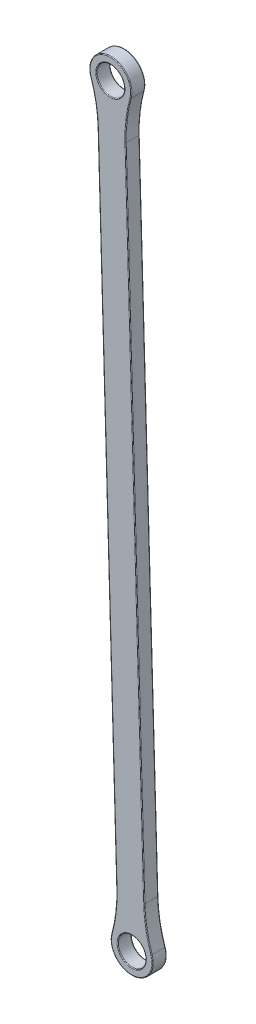
ISO-10303-21;
HEADER;
FILE_DESCRIPTION(('STEP AP214'),'2;1');
FILE_NAME('part.step','',(''),(''),'','','');
FILE_SCHEMA(('AUTOMOTIVE_DESIGN { 1 0 10303 214 1 1 1 1 }'));
ENDSEC;
DATA;
#1=APPLICATION_CONTEXT('core data for automotive mechanical design processes');
#2=APPLICATION_PROTOCOL_DEFINITION('international standard','automotive_design',2000,#1);
#3=PRODUCT_CONTEXT('',#1,'mechanical');
#4=PRODUCT('Part','Part','',(#3));
#5=PRODUCT_RELATED_PRODUCT_CATEGORY('part','',(#4));
#6=PRODUCT_DEFINITION_FORMATION('','',#4);
#7=PRODUCT_DEFINITION_CONTEXT('part definition',#1,'design');
#8=PRODUCT_DEFINITION('design','',#6,#7);
#9=PRODUCT_DEFINITION_SHAPE('','',#8);
#10=(LENGTH_UNIT() NAMED_UNIT(*) SI_UNIT(.MILLI.,.METRE.));
#11=(NAMED_UNIT(*) PLANE_ANGLE_UNIT() SI_UNIT($,.RADIAN.));
#12=(NAMED_UNIT(*) SI_UNIT($,.STERADIAN.) SOLID_ANGLE_UNIT());
#13=UNCERTAINTY_MEASURE_WITH_UNIT(LENGTH_MEASURE(1.E-05),#10,'distance_accuracy_value','');
#14=(GEOMETRIC_REPRESENTATION_CONTEXT(3) GLOBAL_UNCERTAINTY_ASSIGNED_CONTEXT((#13)) GLOBAL_UNIT_ASSIGNED_CONTEXT((#10,
#11,#12)) REPRESENTATION_CONTEXT('',''));
#15=CARTESIAN_POINT('',(0.,0.,0.));
#16=DIRECTION('',(0.,0.,1.));
#17=DIRECTION('',(1.,0.,0.));
#18=AXIS2_PLACEMENT_3D('',#15,#16,#17);
#19=CARTESIAN_POINT('',(33.742734460424,59.5858139379744,-3.));
#20=DIRECTION('',(0.,0.,1.));
#21=DIRECTION('',(1.,0.,0.));
#22=AXIS2_PLACEMENT_3D('',#19,#20,#21);
#23=CYLINDRICAL_SURFACE('',#22,4.5);
#24=DIRECTION('',(0.,0.,1.));
#25=VECTOR('',#24,1.);
#26=CARTESIAN_POINT('',(29.4024735021623,60.7741467256181,-3.));
#27=LINE('',#26,#25);
#28=CARTESIAN_POINT('',(29.4024735021623,60.7741467256181,-0.15));
#29=VERTEX_POINT('',#28);
#30=CARTESIAN_POINT('',(29.4024735021623,60.7741467256181,-2.85));
#31=VERTEX_POINT('',#30);
#32=EDGE_CURVE('E304',#29,#31,#27,.F.);
#33=ORIENTED_EDGE('',*,*,#32,.T.);
#34=CARTESIAN_POINT('',(33.742734460424,59.5858139379744,-2.85));
#35=DIRECTION('',(0.,0.,1.));
#36=DIRECTION('',(1.,0.,0.));
#37=AXIS2_PLACEMENT_3D('',#34,#35,#36);
#38=CIRCLE('',#37,4.5);
#39=CARTESIAN_POINT('',(38.0076191911635,61.0213480662711,-2.85));
#40=VERTEX_POINT('',#39);
#41=EDGE_CURVE('E227',#31,#40,#38,.T.);
#42=ORIENTED_EDGE('',*,*,#41,.T.);
#43=DIRECTION('',(0.,0.,1.));
#44=VECTOR('',#43,1.);
#45=CARTESIAN_POINT('',(38.0076191911635,61.0213480662711,-3.));
#46=LINE('',#45,#44);
#47=CARTESIAN_POINT('',(38.0076191911635,61.0213480662711,-0.15));
#48=VERTEX_POINT('',#47);
#49=EDGE_CURVE('E299',#40,#48,#46,.T.);
#50=ORIENTED_EDGE('',*,*,#49,.T.);
#51=CARTESIAN_POINT('',(33.742734460424,59.5858139379744,-0.15));
#52=DIRECTION('',(0.,0.,1.));
#53=DIRECTION('',(1.,0.,0.));
#54=AXIS2_PLACEMENT_3D('',#51,#52,#53);
#55=CIRCLE('',#54,4.5);
#56=EDGE_CURVE('E225',#48,#29,#55,.F.);
#57=ORIENTED_EDGE('',*,*,#56,.T.);
#58=EDGE_LOOP('',(#33,#42,#50,#57));
#59=FACE_BOUND('',#58,.T.);
#60=ADVANCED_FACE('F39',(#59),#23,.T.);
#61=CARTESIAN_POINT('',(32.4264677407564,0.931520114575329,-3.));
#62=DIRECTION('',(0.999587630540553,0.0287153072475694,0.));
#63=DIRECTION('',(-0.0287153072475694,0.999587630540553,0.));
#64=AXIS2_PLACEMENT_3D('',#61,#62,#63);
#65=PLANE('',#64);
#66=DIRECTION('',(0.,0.,1.));
#67=VECTOR('',#66,1.);
#68=CARTESIAN_POINT('',(26.4384646146928,209.375532391615,-3.));
#69=LINE('',#68,#67);
#70=CARTESIAN_POINT('',(26.4384646146928,209.375532391615,-0.15));
#71=VERTEX_POINT('',#70);
#72=CARTESIAN_POINT('',(26.4384646146928,209.375532391615,-2.85));
#73=VERTEX_POINT('',#72);
#74=EDGE_CURVE('E305',#71,#73,#69,.F.);
#75=ORIENTED_EDGE('',*,*,#74,.T.);
#76=DIRECTION('',(-0.0287153072475694,0.999587630540553,0.));
#77=VECTOR('',#76,1.);
#78=CARTESIAN_POINT('',(32.4264677407564,0.931520114575329,-2.85));
#79=LINE('',#78,#77);
#80=CARTESIAN_POINT('',(30.4550293633007,69.5578245273364,-2.85));
#81=VERTEX_POINT('',#80);
#82=EDGE_CURVE('E219',#73,#81,#79,.F.);
#83=ORIENTED_EDGE('',*,*,#82,.T.);
#84=DIRECTION('',(0.,0.,1.));
#85=VECTOR('',#84,1.);
#86=CARTESIAN_POINT('',(30.4550293633007,69.5578245273364,-3.));
#87=LINE('',#86,#85);
#88=CARTESIAN_POINT('',(30.4550293633007,69.5578245273364,-0.15));
#89=VERTEX_POINT('',#88);
#90=EDGE_CURVE('E310',#81,#89,#87,.T.);
#91=ORIENTED_EDGE('',*,*,#90,.T.);
#92=DIRECTION('',(-0.0287153072475694,0.999587630540553,0.));
#93=VECTOR('',#92,1.);
#94=CARTESIAN_POINT('',(26.4384646146928,209.375532391616,-0.15));
#95=LINE('',#94,#93);
#96=EDGE_CURVE('E217',#89,#71,#95,.T.);
#97=ORIENTED_EDGE('',*,*,#96,.T.);
#98=EDGE_LOOP('',(#75,#83,#91,#97));
#99=FACE_BOUND('',#98,.T.);
#100=ADVANCED_FACE('F351',(#99),#65,.F.);
#101=CARTESIAN_POINT('',(29.1482853008129,219.519834824463,-3.));
#102=DIRECTION('',(0.,0.,1.));
#103=DIRECTION('',(1.,0.,0.));
#104=AXIS2_PLACEMENT_3D('',#101,#102,#103);
#105=CYLINDRICAL_SURFACE('',#104,4.5);
#106=DIRECTION('',(0.,0.,1.));
#107=VECTOR('',#106,1.);
#108=CARTESIAN_POINT('',(33.4885462590746,218.331502036819,-3.));
#109=LINE('',#108,#107);
#110=CARTESIAN_POINT('',(33.4885462590746,218.331502036819,-0.15));
#111=VERTEX_POINT('',#110);
#112=CARTESIAN_POINT('',(33.4885462590746,218.331502036819,-2.85));
#113=VERTEX_POINT('',#112);
#114=EDGE_CURVE('E345',#111,#113,#109,.F.);
#115=ORIENTED_EDGE('',*,*,#114,.T.);
#116=CARTESIAN_POINT('',(29.1482853008129,219.519834824463,-2.85));
#117=DIRECTION('',(0.,0.,1.));
#118=DIRECTION('',(1.,0.,0.));
#119=AXIS2_PLACEMENT_3D('',#116,#117,#118);
#120=CIRCLE('',#119,4.5);
#121=CARTESIAN_POINT('',(24.8834005700733,218.084300696166,-2.85));
#122=VERTEX_POINT('',#121);
#123=EDGE_CURVE('E210',#113,#122,#120,.T.);
#124=ORIENTED_EDGE('',*,*,#123,.T.);
#125=DIRECTION('',(0.,0.,1.));
#126=VECTOR('',#125,1.);
#127=CARTESIAN_POINT('',(24.8834005700733,218.084300696166,-3.));
#128=LINE('',#127,#126);
#129=CARTESIAN_POINT('',(24.8834005700733,218.084300696166,-0.15));
#130=VERTEX_POINT('',#129);
#131=EDGE_CURVE('E340',#122,#130,#128,.T.);
#132=ORIENTED_EDGE('',*,*,#131,.T.);
#133=CARTESIAN_POINT('',(29.1482853008129,219.519834824463,-0.15));
#134=DIRECTION('',(0.,0.,1.));
#135=DIRECTION('',(1.,0.,0.));
#136=AXIS2_PLACEMENT_3D('',#133,#134,#135);
#137=CIRCLE('',#136,4.5);
#138=EDGE_CURVE('E208',#130,#111,#137,.F.);
#139=ORIENTED_EDGE('',*,*,#138,.T.);
#140=EDGE_LOOP('',(#115,#124,#132,#139));
#141=FACE_BOUND('',#140,.T.);
#142=ADVANCED_FACE('F375',(#141),#105,.T.);
#143=CARTESIAN_POINT('',(29.1482853008129,219.519834824463,-3.));
#144=DIRECTION('',(0.,0.,1.));
#145=DIRECTION('',(1.,0.,0.));
#146=AXIS2_PLACEMENT_3D('',#143,#144,#145);
#147=CYLINDRICAL_SURFACE('',#146,3.);
#148=CARTESIAN_POINT('',(29.1482853008129,219.519834824463,-2.85));
#149=DIRECTION('',(0.,0.,1.));
#150=DIRECTION('',(1.,0.,0.));
#151=AXIS2_PLACEMENT_3D('',#148,#149,#150);
#152=CIRCLE('',#151,3.);
#153=CARTESIAN_POINT('',(32.1482853008129,219.519834824463,-2.85));
#154=VERTEX_POINT('',#153);
#155=EDGE_CURVE('E194',#154,#154,#152,.F.);
#156=ORIENTED_EDGE('',*,*,#155,.T.);
#157=EDGE_LOOP('',(#156));
#158=FACE_BOUND('',#157,.T.);
#159=CARTESIAN_POINT('',(29.1482853008129,219.519834824463,-0.15));
#160=DIRECTION('',(0.,0.,1.));
#161=DIRECTION('',(1.,0.,0.));
#162=AXIS2_PLACEMENT_3D('',#159,#160,#161);
#163=CIRCLE('',#162,3.);
#164=CARTESIAN_POINT('',(32.1482853008129,219.519834824463,-0.15));
#165=VERTEX_POINT('',#164);
#166=EDGE_CURVE('E191',#165,#165,#163,.T.);
#167=ORIENTED_EDGE('',*,*,#166,.T.);
#168=EDGE_LOOP('',(#167));
#169=FACE_BOUND('',#168,.T.);
#170=ADVANCED_FACE('F644',(#158,#169),#147,.F.);
#171=CARTESIAN_POINT('',(38.4239935239997,1.10381195806075,-3.));
#172=DIRECTION('',(0.999587630540553,0.0287153072475694,0.));
#173=DIRECTION('',(-0.0287153072475694,0.999587630540553,0.));
#174=AXIS2_PLACEMENT_3D('',#171,#172,#173);
#175=PLANE('',#174);
#176=DIRECTION('',(0.,0.,-1.));
#177=VECTOR('',#176,1.);
#178=CARTESIAN_POINT('',(36.452555146544,69.7301163708219,-3.));
#179=LINE('',#178,#177);
#180=CARTESIAN_POINT('',(36.452555146544,69.7301163708219,-0.15));
#181=VERTEX_POINT('',#180);
#182=CARTESIAN_POINT('',(36.452555146544,69.7301163708219,-2.85));
#183=VERTEX_POINT('',#182);
#184=EDGE_CURVE('E262',#181,#183,#179,.T.);
#185=ORIENTED_EDGE('',*,*,#184,.T.);
#186=DIRECTION('',(-0.0287153072475694,0.999587630540553,0.));
#187=VECTOR('',#186,1.);
#188=CARTESIAN_POINT('',(32.4359903979361,209.547824235101,-2.85));
#189=LINE('',#188,#187);
#190=CARTESIAN_POINT('',(32.4359903979361,209.547824235101,-2.85));
#191=VERTEX_POINT('',#190);
#192=EDGE_CURVE('E202',#183,#191,#189,.T.);
#193=ORIENTED_EDGE('',*,*,#192,.T.);
#194=DIRECTION('',(0.,0.,-1.));
#195=VECTOR('',#194,1.);
#196=CARTESIAN_POINT('',(32.4359903979361,209.547824235101,0.));
#197=LINE('',#196,#195);
#198=CARTESIAN_POINT('',(32.4359903979361,209.547824235101,-0.15));
#199=VERTEX_POINT('',#198);
#200=EDGE_CURVE('E338',#191,#199,#197,.F.);
#201=ORIENTED_EDGE('',*,*,#200,.T.);
#202=DIRECTION('',(-0.0287153072475694,0.999587630540553,0.));
#203=VECTOR('',#202,1.);
#204=CARTESIAN_POINT('',(38.4239935239997,1.10381195806075,-0.15));
#205=LINE('',#204,#203);
#206=EDGE_CURVE('E200',#199,#181,#205,.F.);
#207=ORIENTED_EDGE('',*,*,#206,.T.);
#208=EDGE_LOOP('',(#185,#193,#201,#207));
#209=FACE_BOUND('',#208,.T.);
#210=ADVANCED_FACE('F337',(#209),#175,.T.);
#211=CARTESIAN_POINT('',(33.742734460424,59.5858139379744,-3.));
#212=DIRECTION('',(0.,0.,1.));
#213=DIRECTION('',(1.,0.,0.));
#214=AXIS2_PLACEMENT_3D('',#211,#212,#213);
#215=CYLINDRICAL_SURFACE('',#214,3.);
#216=CARTESIAN_POINT('',(33.742734460424,59.5858139379744,-2.85));
#217=DIRECTION('',(0.,0.,1.));
#218=DIRECTION('',(1.,0.,0.));
#219=AXIS2_PLACEMENT_3D('',#216,#217,#218);
#220=CIRCLE('',#219,3.);
#221=CARTESIAN_POINT('',(36.742734460424,59.5858139379744,-2.85));
#222=VERTEX_POINT('',#221);
#223=EDGE_CURVE('E174',#222,#222,#220,.F.);
#224=ORIENTED_EDGE('',*,*,#223,.T.);
#225=EDGE_LOOP('',(#224));
#226=FACE_BOUND('',#225,.T.);
#227=CARTESIAN_POINT('',(33.742734460424,59.5858139379744,-0.15));
#228=DIRECTION('',(0.,0.,1.));
#229=DIRECTION('',(1.,0.,0.));
#230=AXIS2_PLACEMENT_3D('',#227,#228,#229);
#231=CIRCLE('',#230,3.);
#232=CARTESIAN_POINT('',(36.742734460424,59.5858139379744,-0.15));
#233=VERTEX_POINT('',#232);
#234=EDGE_CURVE('E307',#233,#233,#231,.T.);
#235=ORIENTED_EDGE('',*,*,#234,.T.);
#236=EDGE_LOOP('',(#235));
#237=FACE_BOUND('',#236,.T.);
#238=ADVANCED_FACE('F621',(#226,#237),#215,.F.);
#239=CARTESIAN_POINT('',(0.,0.,-3.));
#240=DIRECTION('',(0.,0.,1.));
#241=DIRECTION('',(1.,0.,0.));
#242=AXIS2_PLACEMENT_3D('',#239,#240,#241);
#243=PLANE('',#242);
#244=CARTESIAN_POINT('',(33.742734460424,59.5858139379744,-3.));
#245=DIRECTION('',(0.,0.,1.));
#246=DIRECTION('',(1.,0.,0.));
#247=AXIS2_PLACEMENT_3D('',#244,#245,#246);
#248=CIRCLE('',#247,3.15);
#249=CARTESIAN_POINT('',(36.892734460424,59.5858139379744,-3.));
#250=VERTEX_POINT('',#249);
#251=EDGE_CURVE('E183',#250,#250,#248,.T.);
#252=ORIENTED_EDGE('',*,*,#251,.T.);
#253=EDGE_LOOP('',(#252));
#254=FACE_BOUND('',#253,.T.);
#255=CARTESIAN_POINT('',(29.1482853008129,219.519834824463,-3.));
#256=DIRECTION('',(0.,0.,1.));
#257=DIRECTION('',(1.,0.,0.));
#258=AXIS2_PLACEMENT_3D('',#255,#256,#257);
#259=CIRCLE('',#258,3.15);
#260=CARTESIAN_POINT('',(32.2982853008129,219.519834824463,-3.));
#261=VERTEX_POINT('',#260);
#262=EDGE_CURVE('E180',#261,#261,#259,.T.);
#263=ORIENTED_EDGE('',*,*,#262,.T.);
#264=EDGE_LOOP('',(#263));
#265=FACE_BOUND('',#264,.T.);
#266=DIRECTION('',(-0.0287153072475694,0.999587630540553,0.));
#267=VECTOR('',#266,1.);
#268=CARTESIAN_POINT('',(36.3026170019629,69.7258090747348,-3.));
#269=LINE('',#268,#267);
#270=CARTESIAN_POINT('',(32.2860522533551,209.543516939014,-3.));
#271=VERTEX_POINT('',#270);
#272=CARTESIAN_POINT('',(36.3026170019629,69.7258090747348,-3.));
#273=VERTEX_POINT('',#272);
#274=EDGE_CURVE('E178',#271,#273,#269,.F.);
#275=ORIENTED_EDGE('',*,*,#274,.T.);
#276=CARTESIAN_POINT('',(66.4401840627606,70.591575588249,-3.));
#277=DIRECTION('',(0.,0.,1.));
#278=DIRECTION('',(1.,0.,0.));
#279=AXIS2_PLACEMENT_3D('',#276,#277,#278);
#280=CIRCLE('',#279,30.15);
#281=CARTESIAN_POINT('',(37.8654563668055,60.9734969286612,-3.));
#282=VERTEX_POINT('',#281);
#283=EDGE_CURVE('E159',#273,#282,#280,.T.);
#284=ORIENTED_EDGE('',*,*,#283,.T.);
#285=CARTESIAN_POINT('',(33.742734460424,59.5858139379744,-3.));
#286=DIRECTION('',(0.,0.,1.));
#287=DIRECTION('',(1.,0.,0.));
#288=AXIS2_PLACEMENT_3D('',#285,#286,#287);
#289=CIRCLE('',#288,4.35);
#290=CARTESIAN_POINT('',(29.5471488674376,60.7345356326966,-3.));
#291=VERTEX_POINT('',#290);
#292=EDGE_CURVE('E167',#282,#291,#289,.F.);
#293=ORIENTED_EDGE('',*,*,#292,.T.);
#294=CARTESIAN_POINT('',(0.4674004470841,68.6963653099093,-3.));
#295=DIRECTION('',(0.,0.,1.));
#296=DIRECTION('',(1.,0.,0.));
#297=AXIS2_PLACEMENT_3D('',#294,#295,#296);
#298=CIRCLE('',#297,30.15);
#299=CARTESIAN_POINT('',(30.6049675078818,69.5621318234236,-3.));
#300=VERTEX_POINT('',#299);
#301=EDGE_CURVE('E173',#291,#300,#298,.T.);
#302=ORIENTED_EDGE('',*,*,#301,.T.);
#303=DIRECTION('',(-0.0287153072475694,0.999587630540553,0.));
#304=VECTOR('',#303,1.);
#305=CARTESIAN_POINT('',(32.5764058853375,0.935827410662464,-3.));
#306=LINE('',#305,#304);
#307=CARTESIAN_POINT('',(26.5884027592739,209.379839687703,-3.));
#308=VERTEX_POINT('',#307);
#309=EDGE_CURVE('E319',#300,#308,#306,.T.);
#310=ORIENTED_EDGE('',*,*,#309,.T.);
#311=CARTESIAN_POINT('',(-3.54916430152379,208.514073174188,-3.));
#312=DIRECTION('',(0.,0.,1.));
#313=DIRECTION('',(1.,0.,0.));
#314=AXIS2_PLACEMENT_3D('',#311,#312,#313);
#315=CIRCLE('',#314,30.15);
#316=CARTESIAN_POINT('',(25.0255633944313,218.132151833776,-3.));
#317=VERTEX_POINT('',#316);
#318=EDGE_CURVE('E321',#308,#317,#315,.T.);
#319=ORIENTED_EDGE('',*,*,#318,.T.);
#320=CARTESIAN_POINT('',(29.1482853008129,219.519834824463,-3.));
#321=DIRECTION('',(0.,0.,1.));
#322=DIRECTION('',(1.,0.,0.));
#323=AXIS2_PLACEMENT_3D('',#320,#321,#322);
#324=CIRCLE('',#323,4.35);
#325=CARTESIAN_POINT('',(33.3438708937992,218.371113129741,-3.));
#326=VERTEX_POINT('',#325);
#327=EDGE_CURVE('E323',#317,#326,#324,.F.);
#328=ORIENTED_EDGE('',*,*,#327,.T.);
#329=CARTESIAN_POINT('',(62.4236193141527,210.409283452528,-3.));
#330=DIRECTION('',(0.,0.,1.));
#331=DIRECTION('',(1.,0.,0.));
#332=AXIS2_PLACEMENT_3D('',#329,#330,#331);
#333=CIRCLE('',#332,30.15);
#334=EDGE_CURVE('E185',#326,#271,#333,.T.);
#335=ORIENTED_EDGE('',*,*,#334,.T.);
#336=EDGE_LOOP('',(#275,#284,#293,#302,#310,#319,#328,#335));
#337=FACE_BOUND('',#336,.T.);
#338=ADVANCED_FACE('F176',(#254,#265,#337),#243,.F.);
#339=CARTESIAN_POINT('',(0.,0.,0.));
#340=DIRECTION('',(0.,0.,1.));
#341=DIRECTION('',(1.,0.,0.));
#342=AXIS2_PLACEMENT_3D('',#339,#340,#341);
#343=PLANE('',#342);
#344=CARTESIAN_POINT('',(33.742734460424,59.5858139379744,0.));
#345=DIRECTION('',(0.,0.,1.));
#346=DIRECTION('',(1.,0.,0.));
#347=AXIS2_PLACEMENT_3D('',#344,#345,#346);
#348=CIRCLE('',#347,3.15);
#349=CARTESIAN_POINT('',(36.892734460424,59.5858139379744,0.));
#350=VERTEX_POINT('',#349);
#351=EDGE_CURVE('E11',#350,#350,#348,.F.);
#352=ORIENTED_EDGE('',*,*,#351,.T.);
#353=EDGE_LOOP('',(#352));
#354=FACE_BOUND('',#353,.T.);
#355=CARTESIAN_POINT('',(29.1482853008129,219.519834824463,0.));
#356=DIRECTION('',(0.,0.,1.));
#357=DIRECTION('',(1.,0.,0.));
#358=AXIS2_PLACEMENT_3D('',#355,#356,#357);
#359=CIRCLE('',#358,3.15);
#360=CARTESIAN_POINT('',(32.2982853008129,219.519834824463,0.));
#361=VERTEX_POINT('',#360);
#362=EDGE_CURVE('E48',#361,#361,#359,.F.);
#363=ORIENTED_EDGE('',*,*,#362,.T.);
#364=EDGE_LOOP('',(#363));
#365=FACE_BOUND('',#364,.T.);
#366=CARTESIAN_POINT('',(29.1482853008129,219.519834824463,0.));
#367=DIRECTION('',(0.,0.,1.));
#368=DIRECTION('',(1.,0.,0.));
#369=AXIS2_PLACEMENT_3D('',#366,#367,#368);
#370=CIRCLE('',#369,4.35);
#371=CARTESIAN_POINT('',(33.3438708937992,218.371113129741,0.));
#372=VERTEX_POINT('',#371);
#373=CARTESIAN_POINT('',(25.0255633944313,218.132151833776,0.));
#374=VERTEX_POINT('',#373);
#375=EDGE_CURVE('E56',#372,#374,#370,.T.);
#376=ORIENTED_EDGE('',*,*,#375,.T.);
#377=CARTESIAN_POINT('',(-3.54916430152379,208.514073174188,0.));
#378=DIRECTION('',(0.,0.,1.));
#379=DIRECTION('',(1.,0.,0.));
#380=AXIS2_PLACEMENT_3D('',#377,#378,#379);
#381=CIRCLE('',#380,30.15);
#382=CARTESIAN_POINT('',(26.5884027592739,209.379839687703,0.));
#383=VERTEX_POINT('',#382);
#384=EDGE_CURVE('E241',#374,#383,#381,.F.);
#385=ORIENTED_EDGE('',*,*,#384,.T.);
#386=DIRECTION('',(-0.0287153072475694,0.999587630540553,0.));
#387=VECTOR('',#386,1.);
#388=CARTESIAN_POINT('',(30.6049675078818,69.5621318234236,0.));
#389=LINE('',#388,#387);
#390=CARTESIAN_POINT('',(30.6049675078818,69.5621318234236,0.));
#391=VERTEX_POINT('',#390);
#392=EDGE_CURVE('E229',#383,#391,#389,.F.);
#393=ORIENTED_EDGE('',*,*,#392,.T.);
#394=CARTESIAN_POINT('',(0.4674004470841,68.6963653099093,0.));
#395=DIRECTION('',(0.,0.,1.));
#396=DIRECTION('',(1.,0.,0.));
#397=AXIS2_PLACEMENT_3D('',#394,#395,#396);
#398=CIRCLE('',#397,30.15);
#399=CARTESIAN_POINT('',(29.5471488674376,60.7345356326966,0.));
#400=VERTEX_POINT('',#399);
#401=EDGE_CURVE('E231',#391,#400,#398,.F.);
#402=ORIENTED_EDGE('',*,*,#401,.T.);
#403=CARTESIAN_POINT('',(33.742734460424,59.5858139379744,0.));
#404=DIRECTION('',(0.,0.,1.));
#405=DIRECTION('',(1.,0.,0.));
#406=AXIS2_PLACEMENT_3D('',#403,#404,#405);
#407=CIRCLE('',#406,4.35);
#408=CARTESIAN_POINT('',(37.8654563668055,60.9734969286612,0.));
#409=VERTEX_POINT('',#408);
#410=EDGE_CURVE('E233',#400,#409,#407,.T.);
#411=ORIENTED_EDGE('',*,*,#410,.T.);
#412=CARTESIAN_POINT('',(66.4401840627606,70.591575588249,0.));
#413=DIRECTION('',(0.,0.,1.));
#414=DIRECTION('',(1.,0.,0.));
#415=AXIS2_PLACEMENT_3D('',#412,#413,#414);
#416=CIRCLE('',#415,30.15);
#417=CARTESIAN_POINT('',(36.3026170019629,69.7258090747348,0.));
#418=VERTEX_POINT('',#417);
#419=EDGE_CURVE('E235',#409,#418,#416,.F.);
#420=ORIENTED_EDGE('',*,*,#419,.T.);
#421=DIRECTION('',(-0.0287153072475694,0.999587630540553,0.));
#422=VECTOR('',#421,1.);
#423=CARTESIAN_POINT('',(38.2740553794187,1.09950466197361,0.));
#424=LINE('',#423,#422);
#425=CARTESIAN_POINT('',(32.2860522533551,209.543516939014,0.));
#426=VERTEX_POINT('',#425);
#427=EDGE_CURVE('E237',#418,#426,#424,.T.);
#428=ORIENTED_EDGE('',*,*,#427,.T.);
#429=CARTESIAN_POINT('',(62.4236193141527,210.409283452528,0.));
#430=DIRECTION('',(0.,0.,1.));
#431=DIRECTION('',(1.,0.,0.));
#432=AXIS2_PLACEMENT_3D('',#429,#430,#431);
#433=CIRCLE('',#432,30.15);
#434=EDGE_CURVE('E61',#426,#372,#433,.F.);
#435=ORIENTED_EDGE('',*,*,#434,.T.);
#436=EDGE_LOOP('',(#376,#385,#393,#402,#411,#420,#428,#435));
#437=FACE_BOUND('',#436,.T.);
#438=ADVANCED_FACE('F394',(#354,#365,#437),#343,.T.);
#439=CARTESIAN_POINT('',(62.4236193141527,210.409283452528,-3.));
#440=DIRECTION('',(0.,0.,1.));
#441=DIRECTION('',(1.,0.,0.));
#442=AXIS2_PLACEMENT_3D('',#439,#440,#441);
#443=CYLINDRICAL_SURFACE('',#442,30.);
#444=ORIENTED_EDGE('',*,*,#200,.F.);
#445=CARTESIAN_POINT('',(62.4236193141527,210.409283452528,-2.85));
#446=DIRECTION('',(0.,0.,1.));
#447=DIRECTION('',(1.,0.,0.));
#448=AXIS2_PLACEMENT_3D('',#445,#446,#447);
#449=CIRCLE('',#448,30.);
#450=EDGE_CURVE('E206',#191,#113,#449,.F.);
#451=ORIENTED_EDGE('',*,*,#450,.T.);
#452=ORIENTED_EDGE('',*,*,#114,.F.);
#453=CARTESIAN_POINT('',(62.4236193141527,210.409283452528,-0.15));
#454=DIRECTION('',(0.,0.,1.));
#455=DIRECTION('',(1.,0.,0.));
#456=AXIS2_PLACEMENT_3D('',#453,#454,#455);
#457=CIRCLE('',#456,30.);
#458=EDGE_CURVE('E204',#111,#199,#457,.T.);
#459=ORIENTED_EDGE('',*,*,#458,.T.);
#460=EDGE_LOOP('',(#444,#451,#452,#459));
#461=FACE_BOUND('',#460,.T.);
#462=ADVANCED_FACE('F417',(#461),#443,.F.);
#463=CARTESIAN_POINT('',(-3.54916430152379,208.514073174188,-3.));
#464=DIRECTION('',(0.,0.,1.));
#465=DIRECTION('',(1.,0.,0.));
#466=AXIS2_PLACEMENT_3D('',#463,#464,#465);
#467=CYLINDRICAL_SURFACE('',#466,30.);
#468=ORIENTED_EDGE('',*,*,#131,.F.);
#469=CARTESIAN_POINT('',(-3.54916430152379,208.514073174188,-2.85));
#470=DIRECTION('',(0.,0.,1.));
#471=DIRECTION('',(1.,0.,0.));
#472=AXIS2_PLACEMENT_3D('',#469,#470,#471);
#473=CIRCLE('',#472,30.);
#474=EDGE_CURVE('E215',#122,#73,#473,.F.);
#475=ORIENTED_EDGE('',*,*,#474,.T.);
#476=ORIENTED_EDGE('',*,*,#74,.F.);
#477=CARTESIAN_POINT('',(-3.54916430152379,208.514073174188,-0.15));
#478=DIRECTION('',(0.,0.,1.));
#479=DIRECTION('',(1.,0.,0.));
#480=AXIS2_PLACEMENT_3D('',#477,#478,#479);
#481=CIRCLE('',#480,30.);
#482=EDGE_CURVE('E212',#71,#130,#481,.T.);
#483=ORIENTED_EDGE('',*,*,#482,.T.);
#484=EDGE_LOOP('',(#468,#475,#476,#483));
#485=FACE_BOUND('',#484,.T.);
#486=ADVANCED_FACE('F372',(#485),#467,.F.);
#487=CARTESIAN_POINT('',(0.4674004470841,68.6963653099093,-3.));
#488=DIRECTION('',(0.,0.,1.));
#489=DIRECTION('',(1.,0.,0.));
#490=AXIS2_PLACEMENT_3D('',#487,#488,#489);
#491=CYLINDRICAL_SURFACE('',#490,30.);
#492=ORIENTED_EDGE('',*,*,#90,.F.);
#493=CARTESIAN_POINT('',(0.4674004470841,68.6963653099093,-2.85));
#494=DIRECTION('',(0.,0.,1.));
#495=DIRECTION('',(1.,0.,0.));
#496=AXIS2_PLACEMENT_3D('',#493,#494,#495);
#497=CIRCLE('',#496,30.);
#498=EDGE_CURVE('E223',#81,#31,#497,.F.);
#499=ORIENTED_EDGE('',*,*,#498,.T.);
#500=ORIENTED_EDGE('',*,*,#32,.F.);
#501=CARTESIAN_POINT('',(0.4674004470841,68.6963653099093,-0.15));
#502=DIRECTION('',(0.,0.,1.));
#503=DIRECTION('',(1.,0.,0.));
#504=AXIS2_PLACEMENT_3D('',#501,#502,#503);
#505=CIRCLE('',#504,30.);
#506=EDGE_CURVE('E221',#29,#89,#505,.T.);
#507=ORIENTED_EDGE('',*,*,#506,.T.);
#508=EDGE_LOOP('',(#492,#499,#500,#507));
#509=FACE_BOUND('',#508,.T.);
#510=ADVANCED_FACE('F391',(#509),#491,.F.);
#511=CARTESIAN_POINT('',(66.4401840627606,70.591575588249,-3.));
#512=DIRECTION('',(0.,0.,1.));
#513=DIRECTION('',(1.,0.,0.));
#514=AXIS2_PLACEMENT_3D('',#511,#512,#513);
#515=CYLINDRICAL_SURFACE('',#514,30.);
#516=ORIENTED_EDGE('',*,*,#49,.F.);
#517=CARTESIAN_POINT('',(66.4401840627606,70.591575588249,-2.85));
#518=DIRECTION('',(0.,0.,1.));
#519=DIRECTION('',(1.,0.,0.));
#520=AXIS2_PLACEMENT_3D('',#517,#518,#519);
#521=CIRCLE('',#520,30.);
#522=EDGE_CURVE('E161',#40,#183,#521,.F.);
#523=ORIENTED_EDGE('',*,*,#522,.T.);
#524=ORIENTED_EDGE('',*,*,#184,.F.);
#525=CARTESIAN_POINT('',(66.4401840627606,70.591575588249,-0.15));
#526=DIRECTION('',(0.,0.,1.));
#527=DIRECTION('',(1.,0.,0.));
#528=AXIS2_PLACEMENT_3D('',#525,#526,#527);
#529=CIRCLE('',#528,30.);
#530=EDGE_CURVE('E197',#181,#48,#529,.T.);
#531=ORIENTED_EDGE('',*,*,#530,.T.);
#532=EDGE_LOOP('',(#516,#523,#524,#531));
#533=FACE_BOUND('',#532,.T.);
#534=ADVANCED_FACE('F298',(#533),#515,.F.);
#535=CARTESIAN_POINT('',(33.742734460424,59.5858139379744,-2.85));
#536=DIRECTION('',(0.,0.,1.));
#537=DIRECTION('',(1.,0.,0.));
#538=AXIS2_PLACEMENT_3D('',#535,#536,#537);
#539=TOROIDAL_SURFACE('',#538,3.15,0.15);
#540=ORIENTED_EDGE('',*,*,#251,.F.);
#541=EDGE_LOOP('',(#540));
#542=FACE_BOUND('',#541,.T.);
#543=ORIENTED_EDGE('',*,*,#223,.F.);
#544=EDGE_LOOP('',(#543));
#545=FACE_BOUND('',#544,.T.);
#546=ADVANCED_FACE('F427',(#542,#545),#539,.T.);
#547=CARTESIAN_POINT('',(29.1482853008129,219.519834824463,-2.85));
#548=DIRECTION('',(0.,0.,1.));
#549=DIRECTION('',(1.,0.,0.));
#550=AXIS2_PLACEMENT_3D('',#547,#548,#549);
#551=TOROIDAL_SURFACE('',#550,3.15,0.15);
#552=ORIENTED_EDGE('',*,*,#155,.F.);
#553=EDGE_LOOP('',(#552));
#554=FACE_BOUND('',#553,.T.);
#555=ORIENTED_EDGE('',*,*,#262,.F.);
#556=EDGE_LOOP('',(#555));
#557=FACE_BOUND('',#556,.T.);
#558=ADVANCED_FACE('F430',(#554,#557),#551,.T.);
#559=CARTESIAN_POINT('',(-3.54916430152379,208.514073174188,-2.85));
#560=DIRECTION('',(0.,0.,1.));
#561=DIRECTION('',(1.,0.,0.));
#562=AXIS2_PLACEMENT_3D('',#559,#560,#561);
#563=TOROIDAL_SURFACE('',#562,30.15,0.15);
#564=CARTESIAN_POINT('',(26.5884027592739,209.379839687703,-2.85));
#565=DIRECTION('',(0.0287153072475734,-0.999587630540553,0.));
#566=DIRECTION('',(0.999587630540553,0.0287153072475734,0.));
#567=AXIS2_PLACEMENT_3D('',#564,#565,#566);
#568=CIRCLE('',#567,0.15);
#569=EDGE_CURVE('E256',#73,#308,#568,.T.);
#570=ORIENTED_EDGE('',*,*,#569,.F.);
#571=ORIENTED_EDGE('',*,*,#474,.F.);
#572=CARTESIAN_POINT('',(25.0255633944313,218.132151833776,-2.85));
#573=DIRECTION('',(-0.319007584065885,0.947752162386585,0.));
#574=DIRECTION('',(-0.947752162386585,-0.319007584065885,0.));
#575=AXIS2_PLACEMENT_3D('',#572,#573,#574);
#576=CIRCLE('',#575,0.15);
#577=EDGE_CURVE('E259',#317,#122,#576,.T.);
#578=ORIENTED_EDGE('',*,*,#577,.F.);
#579=ORIENTED_EDGE('',*,*,#318,.F.);
#580=EDGE_LOOP('',(#570,#571,#578,#579));
#581=FACE_BOUND('',#580,.T.);
#582=ADVANCED_FACE('F384',(#581),#563,.T.);
#583=CARTESIAN_POINT('',(29.1482853008129,219.519834824463,-2.85));
#584=DIRECTION('',(0.,0.,1.));
#585=DIRECTION('',(1.,0.,0.));
#586=AXIS2_PLACEMENT_3D('',#583,#584,#585);
#587=TOROIDAL_SURFACE('',#586,4.35,0.15);
#588=ORIENTED_EDGE('',*,*,#577,.T.);
#589=ORIENTED_EDGE('',*,*,#123,.F.);
#590=CARTESIAN_POINT('',(33.3438708937992,218.371113129741,-2.85));
#591=DIRECTION('',(-0.264073952809617,-0.964502435169297,0.));
#592=DIRECTION('',(0.964502435169297,-0.264073952809617,0.));
#593=AXIS2_PLACEMENT_3D('',#590,#591,#592);
#594=CIRCLE('',#593,0.15);
#595=EDGE_CURVE('E253',#326,#113,#594,.T.);
#596=ORIENTED_EDGE('',*,*,#595,.F.);
#597=ORIENTED_EDGE('',*,*,#327,.F.);
#598=EDGE_LOOP('',(#588,#589,#596,#597));
#599=FACE_BOUND('',#598,.T.);
#600=ADVANCED_FACE('F379',(#599),#587,.T.);
#601=CARTESIAN_POINT('',(32.5764058853375,0.935827410662464,-2.85));
#602=DIRECTION('',(-0.0287153072475694,0.999587630540553,0.));
#603=DIRECTION('',(-0.999587630540553,-0.0287153072475694,0.));
#604=AXIS2_PLACEMENT_3D('',#601,#602,#603);
#605=CYLINDRICAL_SURFACE('',#604,0.15);
#606=ORIENTED_EDGE('',*,*,#569,.T.);
#607=ORIENTED_EDGE('',*,*,#309,.F.);
#608=CARTESIAN_POINT('',(30.6049675078818,69.5621318234236,-2.85));
#609=DIRECTION('',(0.0287153072475734,-0.999587630540553,0.));
#610=DIRECTION('',(0.999587630540553,0.0287153072475734,0.));
#611=AXIS2_PLACEMENT_3D('',#608,#609,#610);
#612=CIRCLE('',#611,0.15);
#613=EDGE_CURVE('E250',#81,#300,#612,.T.);
#614=ORIENTED_EDGE('',*,*,#613,.F.);
#615=ORIENTED_EDGE('',*,*,#82,.F.);
#616=EDGE_LOOP('',(#606,#607,#614,#615));
#617=FACE_BOUND('',#616,.T.);
#618=ADVANCED_FACE('F387',(#617),#605,.T.);
#619=CARTESIAN_POINT('',(62.4236193141527,210.409283452528,-2.85));
#620=DIRECTION('',(0.,0.,1.));
#621=DIRECTION('',(1.,0.,0.));
#622=AXIS2_PLACEMENT_3D('',#619,#620,#621);
#623=TOROIDAL_SURFACE('',#622,30.15,0.15);
#624=ORIENTED_EDGE('',*,*,#595,.T.);
#625=ORIENTED_EDGE('',*,*,#450,.F.);
#626=CARTESIAN_POINT('',(32.2860522533551,209.543516939014,-2.85));
#627=DIRECTION('',(0.0287153072475727,-0.999587630540553,0.));
#628=DIRECTION('',(0.999587630540553,0.0287153072475727,0.));
#629=AXIS2_PLACEMENT_3D('',#626,#627,#628);
#630=CIRCLE('',#629,0.15);
#631=EDGE_CURVE('E247',#271,#191,#630,.T.);
#632=ORIENTED_EDGE('',*,*,#631,.F.);
#633=ORIENTED_EDGE('',*,*,#334,.F.);
#634=EDGE_LOOP('',(#624,#625,#632,#633));
#635=FACE_BOUND('',#634,.T.);
#636=ADVANCED_FACE('F330',(#635),#623,.T.);
#637=CARTESIAN_POINT('',(0.4674004470841,68.6963653099093,-2.85));
#638=DIRECTION('',(0.,0.,1.));
#639=DIRECTION('',(1.,0.,0.));
#640=AXIS2_PLACEMENT_3D('',#637,#638,#639);
#641=TOROIDAL_SURFACE('',#640,30.15,0.15);
#642=ORIENTED_EDGE('',*,*,#613,.T.);
#643=ORIENTED_EDGE('',*,*,#301,.F.);
#644=CARTESIAN_POINT('',(29.5471488674376,60.7345356326966,-2.85));
#645=DIRECTION('',(-0.264073952809715,-0.96450243516927,0.));
#646=DIRECTION('',(0.96450243516927,-0.264073952809715,0.));
#647=AXIS2_PLACEMENT_3D('',#644,#645,#646);
#648=CIRCLE('',#647,0.15);
#649=EDGE_CURVE('E170',#31,#291,#648,.T.);
#650=ORIENTED_EDGE('',*,*,#649,.F.);
#651=ORIENTED_EDGE('',*,*,#498,.F.);
#652=EDGE_LOOP('',(#642,#643,#650,#651));
#653=FACE_BOUND('',#652,.T.);
#654=ADVANCED_FACE('F390',(#653),#641,.T.);
#655=CARTESIAN_POINT('',(38.2740553794186,1.09950466197361,-2.85));
#656=DIRECTION('',(0.0287153072475694,-0.999587630540553,0.));
#657=DIRECTION('',(0.999587630540553,0.0287153072475694,0.));
#658=AXIS2_PLACEMENT_3D('',#655,#656,#657);
#659=CYLINDRICAL_SURFACE('',#658,0.15);
#660=ORIENTED_EDGE('',*,*,#631,.T.);
#661=ORIENTED_EDGE('',*,*,#192,.F.);
#662=CARTESIAN_POINT('',(36.3026170019629,69.7258090747348,-2.85));
#663=DIRECTION('',(0.0287153072475727,-0.999587630540553,0.));
#664=DIRECTION('',(0.999587630540553,0.0287153072475727,0.));
#665=AXIS2_PLACEMENT_3D('',#662,#663,#664);
#666=CIRCLE('',#665,0.15);
#667=EDGE_CURVE('E164',#273,#183,#666,.T.);
#668=ORIENTED_EDGE('',*,*,#667,.F.);
#669=ORIENTED_EDGE('',*,*,#274,.F.);
#670=EDGE_LOOP('',(#660,#661,#668,#669));
#671=FACE_BOUND('',#670,.T.);
#672=ADVANCED_FACE('F333',(#671),#659,.T.);
#673=CARTESIAN_POINT('',(33.742734460424,59.5858139379744,-2.85));
#674=DIRECTION('',(0.,0.,1.));
#675=DIRECTION('',(1.,0.,0.));
#676=AXIS2_PLACEMENT_3D('',#673,#674,#675);
#677=TOROIDAL_SURFACE('',#676,4.35,0.15);
#678=ORIENTED_EDGE('',*,*,#649,.T.);
#679=ORIENTED_EDGE('',*,*,#292,.F.);
#680=CARTESIAN_POINT('',(37.8654563668055,60.9734969286612,-2.85));
#681=DIRECTION('',(-0.319007584065934,0.947752162386568,0.));
#682=DIRECTION('',(-0.947752162386568,-0.319007584065934,0.));
#683=AXIS2_PLACEMENT_3D('',#680,#681,#682);
#684=CIRCLE('',#683,0.15);
#685=EDGE_CURVE('E155',#40,#282,#684,.T.);
#686=ORIENTED_EDGE('',*,*,#685,.F.);
#687=ORIENTED_EDGE('',*,*,#41,.F.);
#688=EDGE_LOOP('',(#678,#679,#686,#687));
#689=FACE_BOUND('',#688,.T.);
#690=ADVANCED_FACE('F168',(#689),#677,.T.);
#691=CARTESIAN_POINT('',(66.4401840627606,70.591575588249,-2.85));
#692=DIRECTION('',(0.,0.,1.));
#693=DIRECTION('',(1.,0.,0.));
#694=AXIS2_PLACEMENT_3D('',#691,#692,#693);
#695=TOROIDAL_SURFACE('',#694,30.15,0.15);
#696=ORIENTED_EDGE('',*,*,#667,.T.);
#697=ORIENTED_EDGE('',*,*,#522,.F.);
#698=ORIENTED_EDGE('',*,*,#685,.T.);
#699=ORIENTED_EDGE('',*,*,#283,.F.);
#700=EDGE_LOOP('',(#696,#697,#698,#699));
#701=FACE_BOUND('',#700,.T.);
#702=ADVANCED_FACE('F157',(#701),#695,.T.);
#703=CARTESIAN_POINT('',(33.742734460424,59.5858139379744,-0.15));
#704=DIRECTION('',(0.,0.,1.));
#705=DIRECTION('',(1.,0.,0.));
#706=AXIS2_PLACEMENT_3D('',#703,#704,#705);
#707=TOROIDAL_SURFACE('',#706,3.15,0.15);
#708=ORIENTED_EDGE('',*,*,#234,.F.);
#709=EDGE_LOOP('',(#708));
#710=FACE_BOUND('',#709,.T.);
#711=ORIENTED_EDGE('',*,*,#351,.F.);
#712=EDGE_LOOP('',(#711));
#713=FACE_BOUND('',#712,.T.);
#714=ADVANCED_FACE('F437',(#710,#713),#707,.T.);
#715=CARTESIAN_POINT('',(29.1482853008129,219.519834824463,-0.15));
#716=DIRECTION('',(0.,0.,1.));
#717=DIRECTION('',(1.,0.,0.));
#718=AXIS2_PLACEMENT_3D('',#715,#716,#717);
#719=TOROIDAL_SURFACE('',#718,3.15,0.15);
#720=ORIENTED_EDGE('',*,*,#362,.F.);
#721=EDGE_LOOP('',(#720));
#722=FACE_BOUND('',#721,.T.);
#723=ORIENTED_EDGE('',*,*,#166,.F.);
#724=EDGE_LOOP('',(#723));
#725=FACE_BOUND('',#724,.T.);
#726=ADVANCED_FACE('F454',(#722,#725),#719,.T.);
#727=CARTESIAN_POINT('',(66.4401840627606,70.591575588249,-0.15));
#728=DIRECTION('',(0.,0.,1.));
#729=DIRECTION('',(1.,0.,0.));
#730=AXIS2_PLACEMENT_3D('',#727,#728,#729);
#731=TOROIDAL_SURFACE('',#730,30.15,0.15);
#732=CARTESIAN_POINT('',(37.8654563668055,60.9734969286612,-0.15));
#733=DIRECTION('',(0.319007584065934,-0.947752162386568,0.));
#734=DIRECTION('',(0.947752162386568,0.319007584065934,0.));
#735=AXIS2_PLACEMENT_3D('',#732,#733,#734);
#736=CIRCLE('',#735,0.15);
#737=EDGE_CURVE('E278',#48,#409,#736,.T.);
#738=ORIENTED_EDGE('',*,*,#737,.F.);
#739=ORIENTED_EDGE('',*,*,#530,.F.);
#740=CARTESIAN_POINT('',(36.3026170019629,69.7258090747348,-0.15));
#741=DIRECTION('',(-0.0287153072475727,0.999587630540553,0.));
#742=DIRECTION('',(-0.999587630540553,-0.0287153072475727,0.));
#743=AXIS2_PLACEMENT_3D('',#740,#741,#742);
#744=CIRCLE('',#743,0.15);
#745=EDGE_CURVE('E43',#418,#181,#744,.T.);
#746=ORIENTED_EDGE('',*,*,#745,.F.);
#747=ORIENTED_EDGE('',*,*,#419,.F.);
#748=EDGE_LOOP('',(#738,#739,#746,#747));
#749=FACE_BOUND('',#748,.T.);
#750=ADVANCED_FACE('F41',(#749),#731,.T.);
#751=CARTESIAN_POINT('',(38.2740553794186,1.09950466197361,-0.15));
#752=DIRECTION('',(-0.0287153072475694,0.999587630540553,0.));
#753=DIRECTION('',(-0.999587630540553,-0.0287153072475694,0.));
#754=AXIS2_PLACEMENT_3D('',#751,#752,#753);
#755=CYLINDRICAL_SURFACE('',#754,0.15);
#756=ORIENTED_EDGE('',*,*,#745,.T.);
#757=ORIENTED_EDGE('',*,*,#206,.F.);
#758=CARTESIAN_POINT('',(32.2860522533551,209.543516939014,-0.15));
#759=DIRECTION('',(-0.0287153072475741,0.999587630540553,0.));
#760=DIRECTION('',(-0.999587630540553,-0.0287153072475741,0.));
#761=AXIS2_PLACEMENT_3D('',#758,#759,#760);
#762=CIRCLE('',#761,0.15);
#763=EDGE_CURVE('E276',#426,#199,#762,.T.);
#764=ORIENTED_EDGE('',*,*,#763,.F.);
#765=ORIENTED_EDGE('',*,*,#427,.F.);
#766=EDGE_LOOP('',(#756,#757,#764,#765));
#767=FACE_BOUND('',#766,.T.);
#768=ADVANCED_FACE('F289',(#767),#755,.T.);
#769=CARTESIAN_POINT('',(33.742734460424,59.5858139379744,-0.15));
#770=DIRECTION('',(0.,0.,1.));
#771=DIRECTION('',(1.,0.,0.));
#772=AXIS2_PLACEMENT_3D('',#769,#770,#771);
#773=TOROIDAL_SURFACE('',#772,4.35,0.15);
#774=ORIENTED_EDGE('',*,*,#737,.T.);
#775=ORIENTED_EDGE('',*,*,#410,.F.);
#776=CARTESIAN_POINT('',(29.5471488674376,60.7345356326966,-0.15));
#777=DIRECTION('',(0.264073952809715,0.96450243516927,0.));
#778=DIRECTION('',(-0.96450243516927,0.264073952809715,0.));
#779=AXIS2_PLACEMENT_3D('',#776,#777,#778);
#780=CIRCLE('',#779,0.15);
#781=EDGE_CURVE('E273',#29,#400,#780,.T.);
#782=ORIENTED_EDGE('',*,*,#781,.F.);
#783=ORIENTED_EDGE('',*,*,#56,.F.);
#784=EDGE_LOOP('',(#774,#775,#782,#783));
#785=FACE_BOUND('',#784,.T.);
#786=ADVANCED_FACE('F393',(#785),#773,.T.);
#787=CARTESIAN_POINT('',(62.4236193141527,210.409283452528,-0.15));
#788=DIRECTION('',(0.,0.,1.));
#789=DIRECTION('',(1.,0.,0.));
#790=AXIS2_PLACEMENT_3D('',#787,#788,#789);
#791=TOROIDAL_SURFACE('',#790,30.15,0.15);
#792=ORIENTED_EDGE('',*,*,#763,.T.);
#793=ORIENTED_EDGE('',*,*,#458,.F.);
#794=CARTESIAN_POINT('',(33.3438708937992,218.371113129741,-0.15));
#795=DIRECTION('',(0.264073952809617,0.964502435169297,0.));
#796=DIRECTION('',(-0.964502435169297,0.264073952809617,0.));
#797=AXIS2_PLACEMENT_3D('',#794,#795,#796);
#798=CIRCLE('',#797,0.15);
#799=EDGE_CURVE('E270',#372,#111,#798,.T.);
#800=ORIENTED_EDGE('',*,*,#799,.F.);
#801=ORIENTED_EDGE('',*,*,#434,.F.);
#802=EDGE_LOOP('',(#792,#793,#800,#801));
#803=FACE_BOUND('',#802,.T.);
#804=ADVANCED_FACE('F397',(#803),#791,.T.);
#805=CARTESIAN_POINT('',(0.4674004470841,68.6963653099093,-0.15));
#806=DIRECTION('',(0.,0.,1.));
#807=DIRECTION('',(1.,0.,0.));
#808=AXIS2_PLACEMENT_3D('',#805,#806,#807);
#809=TOROIDAL_SURFACE('',#808,30.15,0.15);
#810=ORIENTED_EDGE('',*,*,#781,.T.);
#811=ORIENTED_EDGE('',*,*,#401,.F.);
#812=CARTESIAN_POINT('',(30.6049675078818,69.5621318234236,-0.15));
#813=DIRECTION('',(-0.0287153072475734,0.999587630540553,0.));
#814=DIRECTION('',(-0.999587630540553,-0.0287153072475734,0.));
#815=AXIS2_PLACEMENT_3D('',#812,#813,#814);
#816=CIRCLE('',#815,0.15);
#817=EDGE_CURVE('E267',#89,#391,#816,.T.);
#818=ORIENTED_EDGE('',*,*,#817,.F.);
#819=ORIENTED_EDGE('',*,*,#506,.F.);
#820=EDGE_LOOP('',(#810,#811,#818,#819));
#821=FACE_BOUND('',#820,.T.);
#822=ADVANCED_FACE('F360',(#821),#809,.T.);
#823=CARTESIAN_POINT('',(29.1482853008129,219.519834824463,-0.15));
#824=DIRECTION('',(0.,0.,1.));
#825=DIRECTION('',(1.,0.,0.));
#826=AXIS2_PLACEMENT_3D('',#823,#824,#825);
#827=TOROIDAL_SURFACE('',#826,4.35,0.15);
#828=ORIENTED_EDGE('',*,*,#799,.T.);
#829=ORIENTED_EDGE('',*,*,#138,.F.);
#830=CARTESIAN_POINT('',(25.0255633944313,218.132151833776,-0.15));
#831=DIRECTION('',(0.319007584065892,-0.947752162386582,0.));
#832=DIRECTION('',(0.947752162386582,0.319007584065892,0.));
#833=AXIS2_PLACEMENT_3D('',#830,#831,#832);
#834=CIRCLE('',#833,0.15);
#835=EDGE_CURVE('E265',#374,#130,#834,.T.);
#836=ORIENTED_EDGE('',*,*,#835,.F.);
#837=ORIENTED_EDGE('',*,*,#375,.F.);
#838=EDGE_LOOP('',(#828,#829,#836,#837));
#839=FACE_BOUND('',#838,.T.);
#840=ADVANCED_FACE('F399',(#839),#827,.T.);
#841=CARTESIAN_POINT('',(32.5764058853375,0.935827410662464,-0.15));
#842=DIRECTION('',(0.0287153072475694,-0.999587630540553,0.));
#843=DIRECTION('',(0.999587630540553,0.0287153072475694,0.));
#844=AXIS2_PLACEMENT_3D('',#841,#842,#843);
#845=CYLINDRICAL_SURFACE('',#844,0.15);
#846=ORIENTED_EDGE('',*,*,#817,.T.);
#847=ORIENTED_EDGE('',*,*,#392,.F.);
#848=CARTESIAN_POINT('',(26.5884027592739,209.379839687703,-0.15));
#849=DIRECTION('',(-0.0287153072475734,0.999587630540553,0.));
#850=DIRECTION('',(-0.999587630540553,-0.0287153072475734,0.));
#851=AXIS2_PLACEMENT_3D('',#848,#849,#850);
#852=CIRCLE('',#851,0.15);
#853=EDGE_CURVE('E263',#71,#383,#852,.T.);
#854=ORIENTED_EDGE('',*,*,#853,.F.);
#855=ORIENTED_EDGE('',*,*,#96,.F.);
#856=EDGE_LOOP('',(#846,#847,#854,#855));
#857=FACE_BOUND('',#856,.T.);
#858=ADVANCED_FACE('F364',(#857),#845,.T.);
#859=CARTESIAN_POINT('',(-3.54916430152379,208.514073174188,-0.15));
#860=DIRECTION('',(0.,0.,1.));
#861=DIRECTION('',(1.,0.,0.));
#862=AXIS2_PLACEMENT_3D('',#859,#860,#861);
#863=TOROIDAL_SURFACE('',#862,30.15,0.15);
#864=ORIENTED_EDGE('',*,*,#835,.T.);
#865=ORIENTED_EDGE('',*,*,#482,.F.);
#866=ORIENTED_EDGE('',*,*,#853,.T.);
#867=ORIENTED_EDGE('',*,*,#384,.F.);
#868=EDGE_LOOP('',(#864,#865,#866,#867));
#869=FACE_BOUND('',#868,.T.);
#870=ADVANCED_FACE('F368',(#869),#863,.T.);
#871=CLOSED_SHELL('',(#60,#100,#142,#170,#210,#238,#338,#438,#462,#486,#510,#534,#546,#558,#582,
#600,#618,#636,#654,#672,#690,#702,#714,#726,#750,#768,#786,#804,#822,#840,#858,#870));
#872=MANIFOLD_SOLID_BREP('B2',#871);
#873=ADVANCED_BREP_SHAPE_REPRESENTATION('',(#18,#872),#14);
#874=SHAPE_DEFINITION_REPRESENTATION(#9,#873);
ENDSEC;
END-ISO-10303-21;
